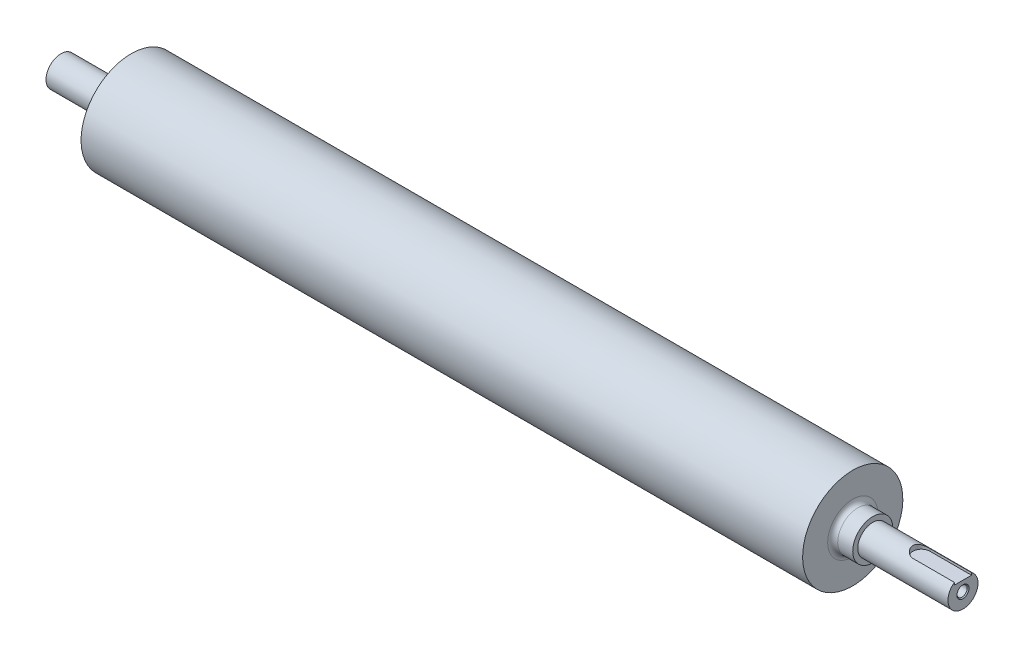
ISO-10303-21;
HEADER;
FILE_DESCRIPTION(('STEP AP214'),'2;1');
FILE_NAME('part.step','',(''),(''),'','','');
FILE_SCHEMA(('AUTOMOTIVE_DESIGN { 1 0 10303 214 1 1 1 1 }'));
ENDSEC;
DATA;
#1=APPLICATION_CONTEXT('core data for automotive mechanical design processes');
#2=APPLICATION_PROTOCOL_DEFINITION('international standard','automotive_design',2000,#1);
#3=PRODUCT_CONTEXT('',#1,'mechanical');
#4=PRODUCT('Part','Part','',(#3));
#5=PRODUCT_RELATED_PRODUCT_CATEGORY('part','',(#4));
#6=PRODUCT_DEFINITION_FORMATION('','',#4);
#7=PRODUCT_DEFINITION_CONTEXT('part definition',#1,'design');
#8=PRODUCT_DEFINITION('design','',#6,#7);
#9=PRODUCT_DEFINITION_SHAPE('','',#8);
#10=(LENGTH_UNIT() NAMED_UNIT(*) SI_UNIT(.MILLI.,.METRE.));
#11=(NAMED_UNIT(*) PLANE_ANGLE_UNIT() SI_UNIT($,.RADIAN.));
#12=(NAMED_UNIT(*) SI_UNIT($,.STERADIAN.) SOLID_ANGLE_UNIT());
#13=UNCERTAINTY_MEASURE_WITH_UNIT(LENGTH_MEASURE(1.E-05),#10,'distance_accuracy_value','');
#14=(GEOMETRIC_REPRESENTATION_CONTEXT(3) GLOBAL_UNCERTAINTY_ASSIGNED_CONTEXT((#13)) GLOBAL_UNIT_ASSIGNED_CONTEXT((#10,
#11,#12)) REPRESENTATION_CONTEXT('',''));
#15=CARTESIAN_POINT('',(0.,0.,0.));
#16=DIRECTION('',(0.,0.,1.));
#17=DIRECTION('',(1.,0.,0.));
#18=AXIS2_PLACEMENT_3D('',#15,#16,#17);
#19=CARTESIAN_POINT('',(0.,0.,0.));
#20=DIRECTION('',(-1.,0.,0.));
#21=DIRECTION('',(0.,-1.,0.));
#22=AXIS2_PLACEMENT_3D('',#19,#20,#21);
#23=PLANE('',#22);
#24=CARTESIAN_POINT('',(0.,0.,0.));
#25=DIRECTION('',(-1.,0.,0.));
#26=DIRECTION('',(0.,0.,1.));
#27=AXIS2_PLACEMENT_3D('',#24,#25,#26);
#28=CIRCLE('',#27,6.025);
#29=CARTESIAN_POINT('',(0.,0.,6.025));
#30=VERTEX_POINT('',#29);
#31=EDGE_CURVE('E124',#30,#30,#28,.T.);
#32=ORIENTED_EDGE('',*,*,#31,.F.);
#33=EDGE_LOOP('',(#32));
#34=FACE_BOUND('',#33,.T.);
#35=CARTESIAN_POINT('',(0.,0.,0.));
#36=DIRECTION('',(1.,0.,0.));
#37=DIRECTION('',(0.,1.,0.));
#38=AXIS2_PLACEMENT_3D('',#35,#36,#37);
#39=CIRCLE('',#38,15.);
#40=CARTESIAN_POINT('',(0.,15.,0.));
#41=VERTEX_POINT('',#40);
#42=EDGE_CURVE('E154',#41,#41,#39,.T.);
#43=ORIENTED_EDGE('',*,*,#42,.F.);
#44=EDGE_LOOP('',(#43));
#45=FACE_BOUND('',#44,.T.);
#46=ADVANCED_FACE('F36',(#34,#45),#23,.T.);
#47=CARTESIAN_POINT('',(900.,0.,0.));
#48=DIRECTION('',(1.,0.,0.));
#49=DIRECTION('',(0.,1.,0.));
#50=AXIS2_PLACEMENT_3D('',#47,#48,#49);
#51=CYLINDRICAL_SURFACE('',#50,15.);
#52=ORIENTED_EDGE('',*,*,#42,.T.);
#53=EDGE_LOOP('',(#52));
#54=FACE_BOUND('',#53,.T.);
#55=CARTESIAN_POINT('',(50.,0.,0.));
#56=DIRECTION('',(1.,0.,0.));
#57=DIRECTION('',(0.,1.,0.));
#58=AXIS2_PLACEMENT_3D('',#55,#56,#57);
#59=CIRCLE('',#58,15.);
#60=CARTESIAN_POINT('',(50.,15.,0.));
#61=VERTEX_POINT('',#60);
#62=EDGE_CURVE('E151',#61,#61,#59,.T.);
#63=ORIENTED_EDGE('',*,*,#62,.F.);
#64=EDGE_LOOP('',(#63));
#65=FACE_BOUND('',#64,.T.);
#66=ADVANCED_FACE('F194',(#54,#65),#51,.T.);
#67=CARTESIAN_POINT('',(50.,15.,0.));
#68=DIRECTION('',(-1.,0.,0.));
#69=DIRECTION('',(0.,-1.,0.));
#70=AXIS2_PLACEMENT_3D('',#67,#68,#69);
#71=PLANE('',#70);
#72=ORIENTED_EDGE('',*,*,#62,.T.);
#73=EDGE_LOOP('',(#72));
#74=FACE_BOUND('',#73,.T.);
#75=CARTESIAN_POINT('',(50.,0.,0.));
#76=DIRECTION('',(1.,0.,0.));
#77=DIRECTION('',(0.,1.,0.));
#78=AXIS2_PLACEMENT_3D('',#75,#76,#77);
#79=CIRCLE('',#78,20.);
#80=CARTESIAN_POINT('',(50.,20.,0.));
#81=VERTEX_POINT('',#80);
#82=EDGE_CURVE('E148',#81,#81,#79,.T.);
#83=ORIENTED_EDGE('',*,*,#82,.F.);
#84=EDGE_LOOP('',(#83));
#85=FACE_BOUND('',#84,.T.);
#86=ADVANCED_FACE('F200',(#74,#85),#71,.T.);
#87=CARTESIAN_POINT('',(900.,0.,0.));
#88=DIRECTION('',(1.,0.,0.));
#89=DIRECTION('',(0.,1.,0.));
#90=AXIS2_PLACEMENT_3D('',#87,#88,#89);
#91=CYLINDRICAL_SURFACE('',#90,20.);
#92=CARTESIAN_POINT('',(65.0000000000001,0.,0.));
#93=DIRECTION('',(-1.,0.,0.));
#94=DIRECTION('',(0.,-1.,0.));
#95=AXIS2_PLACEMENT_3D('',#92,#93,#94);
#96=CIRCLE('',#95,20.);
#97=CARTESIAN_POINT('',(65.0000000000001,-20.,0.));
#98=VERTEX_POINT('',#97);
#99=EDGE_CURVE('E160',#98,#98,#96,.T.);
#100=ORIENTED_EDGE('',*,*,#99,.T.);
#101=EDGE_LOOP('',(#100));
#102=FACE_BOUND('',#101,.T.);
#103=ORIENTED_EDGE('',*,*,#82,.T.);
#104=EDGE_LOOP('',(#103));
#105=FACE_BOUND('',#104,.T.);
#106=ADVANCED_FACE('F224',(#102,#105),#91,.T.);
#107=CARTESIAN_POINT('',(70.,20.,0.));
#108=DIRECTION('',(-1.,0.,0.));
#109=DIRECTION('',(0.,-1.,0.));
#110=AXIS2_PLACEMENT_3D('',#107,#108,#109);
#111=PLANE('',#110);
#112=CARTESIAN_POINT('',(70.,0.,0.));
#113=DIRECTION('',(-1.,0.,0.));
#114=DIRECTION('',(0.,-1.,0.));
#115=AXIS2_PLACEMENT_3D('',#112,#113,#114);
#116=CIRCLE('',#115,25.);
#117=CARTESIAN_POINT('',(70.,-25.,0.));
#118=VERTEX_POINT('',#117);
#119=EDGE_CURVE('E157',#118,#118,#116,.F.);
#120=ORIENTED_EDGE('',*,*,#119,.T.);
#121=EDGE_LOOP('',(#120));
#122=FACE_BOUND('',#121,.T.);
#123=CARTESIAN_POINT('',(70.,0.,0.));
#124=DIRECTION('',(1.,0.,0.));
#125=DIRECTION('',(0.,1.,0.));
#126=AXIS2_PLACEMENT_3D('',#123,#124,#125);
#127=CIRCLE('',#126,49.9999999999999);
#128=CARTESIAN_POINT('',(70.,49.9999999999999,0.));
#129=VERTEX_POINT('',#128);
#130=EDGE_CURVE('E145',#129,#129,#127,.T.);
#131=ORIENTED_EDGE('',*,*,#130,.F.);
#132=EDGE_LOOP('',(#131));
#133=FACE_BOUND('',#132,.T.);
#134=ADVANCED_FACE('F220',(#122,#133),#111,.T.);
#135=CARTESIAN_POINT('',(900.,0.,0.));
#136=DIRECTION('',(1.,0.,0.));
#137=DIRECTION('',(0.,1.,0.));
#138=AXIS2_PLACEMENT_3D('',#135,#136,#137);
#139=CYLINDRICAL_SURFACE('',#138,49.9999999999999);
#140=ORIENTED_EDGE('',*,*,#130,.T.);
#141=EDGE_LOOP('',(#140));
#142=FACE_BOUND('',#141,.T.);
#143=CARTESIAN_POINT('',(790.,0.,0.));
#144=DIRECTION('',(1.,0.,0.));
#145=DIRECTION('',(0.,1.,0.));
#146=AXIS2_PLACEMENT_3D('',#143,#144,#145);
#147=CIRCLE('',#146,49.9999999999998);
#148=CARTESIAN_POINT('',(790.,49.9999999999999,0.));
#149=VERTEX_POINT('',#148);
#150=EDGE_CURVE('E142',#149,#149,#147,.T.);
#151=ORIENTED_EDGE('',*,*,#150,.F.);
#152=EDGE_LOOP('',(#151));
#153=FACE_BOUND('',#152,.T.);
#154=ADVANCED_FACE('F223',(#142,#153),#139,.T.);
#155=CARTESIAN_POINT('',(790.,49.9999999999999,0.));
#156=DIRECTION('',(1.,0.,0.));
#157=DIRECTION('',(0.,1.,0.));
#158=AXIS2_PLACEMENT_3D('',#155,#156,#157);
#159=PLANE('',#158);
#160=CARTESIAN_POINT('',(790.,0.,0.));
#161=DIRECTION('',(1.,0.,0.));
#162=DIRECTION('',(0.,1.,0.));
#163=AXIS2_PLACEMENT_3D('',#160,#161,#162);
#164=CIRCLE('',#163,24.9999999999999);
#165=CARTESIAN_POINT('',(790.,25.,0.));
#166=VERTEX_POINT('',#165);
#167=EDGE_CURVE('E166',#166,#166,#164,.F.);
#168=ORIENTED_EDGE('',*,*,#167,.T.);
#169=EDGE_LOOP('',(#168));
#170=FACE_BOUND('',#169,.T.);
#171=ORIENTED_EDGE('',*,*,#150,.T.);
#172=EDGE_LOOP('',(#171));
#173=FACE_BOUND('',#172,.T.);
#174=ADVANCED_FACE('F190',(#170,#173),#159,.T.);
#175=CARTESIAN_POINT('',(900.,0.,0.));
#176=DIRECTION('',(1.,0.,0.));
#177=DIRECTION('',(0.,1.,0.));
#178=AXIS2_PLACEMENT_3D('',#175,#176,#177);
#179=CYLINDRICAL_SURFACE('',#178,19.9999999999999);
#180=CARTESIAN_POINT('',(795.,0.,0.));
#181=DIRECTION('',(1.,0.,0.));
#182=DIRECTION('',(0.,1.,0.));
#183=AXIS2_PLACEMENT_3D('',#180,#181,#182);
#184=CIRCLE('',#183,19.9999999999999);
#185=CARTESIAN_POINT('',(795.,20.,0.));
#186=VERTEX_POINT('',#185);
#187=EDGE_CURVE('E163',#186,#186,#184,.T.);
#188=ORIENTED_EDGE('',*,*,#187,.T.);
#189=EDGE_LOOP('',(#188));
#190=FACE_BOUND('',#189,.T.);
#191=CARTESIAN_POINT('',(810.,0.,0.));
#192=DIRECTION('',(1.,0.,0.));
#193=DIRECTION('',(0.,1.,0.));
#194=AXIS2_PLACEMENT_3D('',#191,#192,#193);
#195=CIRCLE('',#194,19.9999999999999);
#196=CARTESIAN_POINT('',(810.,20.,0.));
#197=VERTEX_POINT('',#196);
#198=EDGE_CURVE('E139',#197,#197,#195,.T.);
#199=ORIENTED_EDGE('',*,*,#198,.F.);
#200=EDGE_LOOP('',(#199));
#201=FACE_BOUND('',#200,.T.);
#202=ADVANCED_FACE('F184',(#190,#201),#179,.T.);
#203=CARTESIAN_POINT('',(810.,20.,0.));
#204=DIRECTION('',(1.,0.,0.));
#205=DIRECTION('',(0.,1.,0.));
#206=AXIS2_PLACEMENT_3D('',#203,#204,#205);
#207=PLANE('',#206);
#208=ORIENTED_EDGE('',*,*,#198,.T.);
#209=EDGE_LOOP('',(#208));
#210=FACE_BOUND('',#209,.T.);
#211=CARTESIAN_POINT('',(810.,0.,0.));
#212=DIRECTION('',(1.,0.,0.));
#213=DIRECTION('',(0.,1.,0.));
#214=AXIS2_PLACEMENT_3D('',#211,#212,#213);
#215=CIRCLE('',#214,14.9999999999999);
#216=CARTESIAN_POINT('',(810.,15.,0.));
#217=VERTEX_POINT('',#216);
#218=EDGE_CURVE('E136',#217,#217,#215,.T.);
#219=ORIENTED_EDGE('',*,*,#218,.F.);
#220=EDGE_LOOP('',(#219));
#221=FACE_BOUND('',#220,.T.);
#222=ADVANCED_FACE('F180',(#210,#221),#207,.T.);
#223=CARTESIAN_POINT('',(900.,0.,0.));
#224=DIRECTION('',(1.,0.,0.));
#225=DIRECTION('',(0.,1.,0.));
#226=AXIS2_PLACEMENT_3D('',#223,#224,#225);
#227=CYLINDRICAL_SURFACE('',#226,14.9999999999999);
#228=CARTESIAN_POINT('',(858.516691337462,12.3477110697649,-8.51669133746234));
#229=CARTESIAN_POINT('',(858.407672641122,12.3477077727385,-8.51669246434841));
#230=CARTESIAN_POINT('',(858.298670242355,12.3491555146544,-8.51459757874882));
#231=CARTESIAN_POINT('',(858.080908036828,12.354919753233,-8.50623275242589));
#232=CARTESIAN_POINT('',(857.972148216093,12.3592360801008,-8.49996305881431));
#233=CARTESIAN_POINT('',(857.646762698229,12.3764258314548,-8.47493488096605));
#234=CARTESIAN_POINT('',(857.430794556455,12.3935401697776,-8.44995721966952));
#235=CARTESIAN_POINT('',(857.004068723412,12.4382172396189,-8.38405074965424));
#236=CARTESIAN_POINT('',(856.793284688622,12.4657037328173,-8.3432382711422));
#237=CARTESIAN_POINT('',(856.376730376154,12.5300855913342,-8.24623176441527));
#238=CARTESIAN_POINT('',(856.170960948569,12.5669825399537,-8.19003514771556));
#239=CARTESIAN_POINT('',(855.766332803537,12.6487664406347,-8.06314926250904));
#240=CARTESIAN_POINT('',(855.567454231068,12.6936276703905,-7.99250654235003));
#241=CARTESIAN_POINT('',(855.176912286808,12.7900062713731,-7.83735135739228));
#242=CARTESIAN_POINT('',(854.985248745618,12.8415234862011,-7.75283921847733));
#243=CARTESIAN_POINT('',(854.421531968467,13.0041043325599,-7.47919319537714));
#244=CARTESIAN_POINT('',(854.061268641586,13.1230865102507,-7.27011363066637));
#245=CARTESIAN_POINT('',(853.340401071719,13.3841300765087,-6.7786665526918));
#246=CARTESIAN_POINT('',(852.983921520788,13.5272975557339,-6.49083747834792));
#247=CARTESIAN_POINT('',(852.487029309128,13.7404696222977,-6.01909036094985));
#248=CARTESIAN_POINT('',(852.327633805543,13.8112983374042,-5.85508327425442));
#249=CARTESIAN_POINT('',(852.022085635791,13.9508915557485,-5.5142092420008));
#250=CARTESIAN_POINT('',(851.875935540303,14.0196556565599,-5.33733981206233));
#251=CARTESIAN_POINT('',(851.584735150554,14.1598094627858,-4.95431118953132));
#252=CARTESIAN_POINT('',(851.441075094938,14.2308400063278,-4.74696095414549));
#253=CARTESIAN_POINT('',(851.171968887111,14.3665382417819,-4.31890675703661));
#254=CARTESIAN_POINT('',(851.046514631114,14.4312087605183,-4.09820879902976));
#255=CARTESIAN_POINT('',(850.815092010783,14.5523497288875,-3.6447452485219));
#256=CARTESIAN_POINT('',(850.709117266663,14.6088228619879,-3.41198363915));
#257=CARTESIAN_POINT('',(850.51794991014,14.7118777482923,-2.93597002576764));
#258=CARTESIAN_POINT('',(850.43275431056,14.758460923136,-2.69271953554569));
#259=CARTESIAN_POINT('',(850.290884900109,14.836666647783,-2.21939845462044));
#260=CARTESIAN_POINT('',(850.232367614676,14.8692416482904,-1.99003721841042));
#261=CARTESIAN_POINT('',(850.134481358335,14.9239995363668,-1.52603725678184));
#262=CARTESIAN_POINT('',(850.095111366646,14.9461829779281,-1.29139881339957));
#263=CARTESIAN_POINT('',(850.036135010981,14.9794930563298,-0.819030995849451));
#264=CARTESIAN_POINT('',(850.016515310743,14.9906271540986,-0.581303817344407));
#265=CARTESIAN_POINT('',(849.997307978112,15.0015264255663,-0.104789220751186));
#266=CARTESIAN_POINT('',(849.997718610467,15.0012925840829,0.133998103703245));
#267=CARTESIAN_POINT('',(850.017391605336,14.990130664963,0.583797621612019));
#268=CARTESIAN_POINT('',(850.034545250286,14.9803988347825,0.794935865094473));
#269=CARTESIAN_POINT('',(850.084429952782,14.9522097179933,1.21477685728113));
#270=CARTESIAN_POINT('',(850.117161036398,14.933752416781,1.42347960190849));
#271=CARTESIAN_POINT('',(850.197806795425,14.8885424231476,1.83700049918682));
#272=CARTESIAN_POINT('',(850.245721103872,14.8617899312133,2.04181874559542));
#273=CARTESIAN_POINT('',(850.35619628419,14.8005924094421,2.44628484920703));
#274=CARTESIAN_POINT('',(850.418757738316,14.7661470738011,2.64593250051767));
#275=CARTESIAN_POINT('',(850.558519344444,14.6899626675194,3.04068353609363));
#276=CARTESIAN_POINT('',(850.635845800832,14.6481609292471,3.2357300770082));
#277=CARTESIAN_POINT('',(850.804058482526,14.5583527793617,3.61843340420808));
#278=CARTESIAN_POINT('',(850.89494915761,14.5103443323144,3.80608773983012));
#279=CARTESIAN_POINT('',(851.186840102848,14.3584445474195,4.35656724698288));
#280=CARTESIAN_POINT('',(851.407149168595,14.2466284336565,4.70715999384036));
#281=CARTESIAN_POINT('',(851.920883766841,13.9969532552774,5.40726861391742));
#282=CARTESIAN_POINT('',(852.219736883575,13.8575799144114,5.75225900977505));
#283=CARTESIAN_POINT('',(852.705535425212,13.6460358182685,6.23027180670539));
#284=CARTESIAN_POINT('',(852.873909279694,13.5750346047997,6.3831641473334));
#285=CARTESIAN_POINT('',(853.222615146312,13.4338295512965,6.67521465650675));
#286=CARTESIAN_POINT('',(853.402949305332,13.3636258570806,6.81437034809838));
#287=CARTESIAN_POINT('',(853.793206315429,13.2189741046894,7.0912255666873));
#288=CARTESIAN_POINT('',(854.004292910521,13.1447908710425,7.22742623816511));
#289=CARTESIAN_POINT('',(854.439002717186,13.001977000061,7.48129668047002));
#290=CARTESIAN_POINT('',(854.662620216758,12.9333438671066,7.59897480280042));
#291=CARTESIAN_POINT('',(855.120801565057,12.8042901976534,7.81446714873892));
#292=CARTESIAN_POINT('',(855.355336781302,12.7438496440936,7.91233008725204));
#293=CARTESIAN_POINT('',(855.834398275209,12.6335436829447,8.08729203042861));
#294=CARTESIAN_POINT('',(856.078920518123,12.5836740541418,8.16439932663038));
#295=CARTESIAN_POINT('',(856.503749934775,12.5095058981357,8.27740280773591));
#296=CARTESIAN_POINT('',(856.682061544289,12.4819881224689,8.31876303434263));
#297=CARTESIAN_POINT('',(857.041883783593,12.4341963813942,8.39002955529108));
#298=CARTESIAN_POINT('',(857.223393448914,12.4139202699955,8.41993924306854));
#299=CARTESIAN_POINT('',(857.589546247243,12.3811244305227,8.46809672357061));
#300=CARTESIAN_POINT('',(857.774200229899,12.3686423487691,8.48628792744693));
#301=CARTESIAN_POINT('',(858.144792457804,12.3519106241566,8.51060180200336));
#302=CARTESIAN_POINT('',(858.330731475719,12.3476664636798,8.51671643570679));
#303=CARTESIAN_POINT('',(858.516691337462,12.3477110697649,8.51669133746234));
#304=B_SPLINE_CURVE_WITH_KNOTS('',3,(#228,#229,#230,#231,#232,#233,#234,#235,#236,#237,#238,
#239,#240,#241,#242,#243,#244,#245,#246,#247,#248,#249,#250,#251,#252,#253,#254,#255,#256,#257,
#258,#259,#260,#261,#262,#263,#264,#265,#266,#267,#268,#269,#270,#271,#272,#273,#274,#275,#276,
#277,#278,#279,#280,#281,#282,#283,#284,#285,#286,#287,#288,#289,#290,#291,#292,#293,#294,#295,
#296,#297,#298,#299,#300,#301,#302,#303),.UNSPECIFIED.,.F.,.F.,(4,2,2,2,2,2,2,2,2,2,2,2,2,2,2,2,
2,2,2,2,2,2,2,2,2,2,2,2,2,2,2,2,2,2,2,2,2,4),(0.,0.326994289644681,0.653969225834754,
1.30721269973033,1.95574532731684,2.60438714202298,3.25097093069432,3.8975395290373,
5.19231699698927,6.62625025568624,7.34392533637858,8.06173940712896,8.84691424496992,
9.63173850575026,10.4163052669644,11.2007591735457,11.9165677813566,12.6323382238079,
13.3476250218746,14.0628498539273,14.6982650249473,15.3336812594531,15.9690821377592,
16.604508278859,17.2456355565734,17.886973622062,19.1688442390123,20.5943975515397,
21.3086090656761,22.0229491300651,22.8077827153306,23.5922614124504,24.3747874325763,
25.1570003809022,25.7118323707824,26.2664998053613,26.8238260522251,27.3815230757821),.UNSPECIFIED.);
#305=CARTESIAN_POINT('',(858.516691337462,12.3477110697649,-8.51669133746234));
#306=VERTEX_POINT('',#305);
#307=CARTESIAN_POINT('',(858.516691337462,12.3477110697649,8.51669133746234));
#308=VERTEX_POINT('',#307);
#309=EDGE_CURVE('E11',#306,#308,#304,.T.);
#310=ORIENTED_EDGE('',*,*,#309,.F.);
#311=DIRECTION('',(1.,0.,0.));
#312=VECTOR('',#311,1.);
#313=CARTESIAN_POINT('',(900.,12.3477110697649,-8.51669133746234));
#314=LINE('',#313,#312);
#315=CARTESIAN_POINT('',(900.,12.3477110697649,-8.51669133746234));
#316=VERTEX_POINT('',#315);
#317=EDGE_CURVE('E112',#316,#306,#314,.F.);
#318=ORIENTED_EDGE('',*,*,#317,.F.);
#319=CARTESIAN_POINT('',(900.,0.,0.));
#320=DIRECTION('',(1.,0.,0.));
#321=DIRECTION('',(0.,1.,0.));
#322=AXIS2_PLACEMENT_3D('',#319,#320,#321);
#323=CIRCLE('',#322,14.9999999999999);
#324=CARTESIAN_POINT('',(900.,12.3477110697649,8.51669133746234));
#325=VERTEX_POINT('',#324);
#326=EDGE_CURVE('E133',#325,#316,#323,.T.);
#327=ORIENTED_EDGE('',*,*,#326,.F.);
#328=DIRECTION('',(1.,0.,0.));
#329=VECTOR('',#328,1.);
#330=CARTESIAN_POINT('',(900.,12.3477110697649,8.51669133746234));
#331=LINE('',#330,#329);
#332=EDGE_CURVE('E107',#308,#325,#331,.T.);
#333=ORIENTED_EDGE('',*,*,#332,.F.);
#334=EDGE_LOOP('',(#310,#318,#327,#333));
#335=FACE_BOUND('',#334,.T.);
#336=ORIENTED_EDGE('',*,*,#218,.T.);
#337=EDGE_LOOP('',(#336));
#338=FACE_BOUND('',#337,.T.);
#339=ADVANCED_FACE('F177',(#335,#338),#227,.T.);
#340=CARTESIAN_POINT('',(900.,15.,0.));
#341=DIRECTION('',(1.,0.,0.));
#342=DIRECTION('',(0.,1.,0.));
#343=AXIS2_PLACEMENT_3D('',#340,#341,#342);
#344=PLANE('',#343);
#345=DIRECTION('',(0.,1.,0.));
#346=VECTOR('',#345,1.);
#347=CARTESIAN_POINT('',(900.,10.,-8.51669133746234));
#348=LINE('',#347,#346);
#349=CARTESIAN_POINT('',(900.,10.,-8.51669133746234));
#350=VERTEX_POINT('',#349);
#351=EDGE_CURVE('E108',#350,#316,#348,.T.);
#352=ORIENTED_EDGE('',*,*,#351,.F.);
#353=DIRECTION('',(0.,0.,1.));
#354=VECTOR('',#353,1.);
#355=CARTESIAN_POINT('',(900.,10.,0.));
#356=LINE('',#355,#354);
#357=CARTESIAN_POINT('',(900.,10.,8.51669133746234));
#358=VERTEX_POINT('',#357);
#359=EDGE_CURVE('E50',#350,#358,#356,.T.);
#360=ORIENTED_EDGE('',*,*,#359,.T.);
#361=DIRECTION('',(0.,1.,0.));
#362=VECTOR('',#361,1.);
#363=CARTESIAN_POINT('',(900.,10.,8.51669133746234));
#364=LINE('',#363,#362);
#365=EDGE_CURVE('E93',#358,#325,#364,.T.);
#366=ORIENTED_EDGE('',*,*,#365,.T.);
#367=ORIENTED_EDGE('',*,*,#326,.T.);
#368=EDGE_LOOP('',(#352,#360,#366,#367));
#369=FACE_BOUND('',#368,.T.);
#370=CARTESIAN_POINT('',(900.,0.,0.));
#371=DIRECTION('',(1.,0.,0.));
#372=DIRECTION('',(0.,0.,-1.));
#373=AXIS2_PLACEMENT_3D('',#370,#371,#372);
#374=CIRCLE('',#373,6.025);
#375=CARTESIAN_POINT('',(900.,0.,-6.025));
#376=VERTEX_POINT('',#375);
#377=EDGE_CURVE('E115',#376,#376,#374,.T.);
#378=ORIENTED_EDGE('',*,*,#377,.F.);
#379=EDGE_LOOP('',(#378));
#380=FACE_BOUND('',#379,.T.);
#381=ADVANCED_FACE('F170',(#369,#380),#344,.T.);
#382=CARTESIAN_POINT('',(65.0000000000001,0.,0.));
#383=DIRECTION('',(-1.,0.,0.));
#384=DIRECTION('',(0.,-1.,0.));
#385=AXIS2_PLACEMENT_3D('',#382,#383,#384);
#386=TOROIDAL_SURFACE('',#385,25.,5.);
#387=ORIENTED_EDGE('',*,*,#99,.F.);
#388=EDGE_LOOP('',(#387));
#389=FACE_BOUND('',#388,.T.);
#390=ORIENTED_EDGE('',*,*,#119,.F.);
#391=EDGE_LOOP('',(#390));
#392=FACE_BOUND('',#391,.T.);
#393=ADVANCED_FACE('F206',(#389,#392),#386,.F.);
#394=CARTESIAN_POINT('',(795.,0.,0.));
#395=DIRECTION('',(1.,0.,0.));
#396=DIRECTION('',(0.,1.,0.));
#397=AXIS2_PLACEMENT_3D('',#394,#395,#396);
#398=TOROIDAL_SURFACE('',#397,24.9999999999999,5.);
#399=ORIENTED_EDGE('',*,*,#167,.F.);
#400=EDGE_LOOP('',(#399));
#401=FACE_BOUND('',#400,.T.);
#402=ORIENTED_EDGE('',*,*,#187,.F.);
#403=EDGE_LOOP('',(#402));
#404=FACE_BOUND('',#403,.T.);
#405=ADVANCED_FACE('F38',(#401,#404),#398,.F.);
#406=CARTESIAN_POINT('',(29.25,0.,0.));
#407=DIRECTION('',(-1.,0.,0.));
#408=DIRECTION('',(0.,0.,1.));
#409=AXIS2_PLACEMENT_3D('',#406,#407,#408);
#410=CONICAL_SURFACE('',#409,5.09999999999998,1.02974425867665);
#411=CARTESIAN_POINT('',(32.3143891570406,0.,0.));
#412=VERTEX_POINT('',#411);
#413=VERTEX_LOOP('',#412);
#414=FACE_BOUND('',#413,.T.);
#415=CARTESIAN_POINT('',(29.25,0.,0.));
#416=DIRECTION('',(-1.,0.,0.));
#417=DIRECTION('',(0.,0.,1.));
#418=AXIS2_PLACEMENT_3D('',#415,#416,#417);
#419=CIRCLE('',#418,5.09999999999998);
#420=CARTESIAN_POINT('',(29.25,0.,5.09999999999998));
#421=VERTEX_POINT('',#420);
#422=EDGE_CURVE('E130',#421,#421,#419,.T.);
#423=ORIENTED_EDGE('',*,*,#422,.T.);
#424=EDGE_LOOP('',(#423));
#425=FACE_BOUND('',#424,.T.);
#426=ADVANCED_FACE('F213',(#414,#425),#410,.F.);
#427=CARTESIAN_POINT('',(0.,0.,0.));
#428=DIRECTION('',(-1.,0.,0.));
#429=DIRECTION('',(0.,0.,1.));
#430=AXIS2_PLACEMENT_3D('',#427,#428,#429);
#431=CYLINDRICAL_SURFACE('',#430,5.09999999999999);
#432=ORIENTED_EDGE('',*,*,#422,.F.);
#433=EDGE_LOOP('',(#432));
#434=FACE_BOUND('',#433,.T.);
#435=CARTESIAN_POINT('',(0.925000000000023,0.,0.));
#436=DIRECTION('',(-1.,0.,0.));
#437=DIRECTION('',(0.,0.,1.));
#438=AXIS2_PLACEMENT_3D('',#435,#436,#437);
#439=CIRCLE('',#438,5.09999999999999);
#440=CARTESIAN_POINT('',(0.925000000000023,0.,5.09999999999999));
#441=VERTEX_POINT('',#440);
#442=EDGE_CURVE('E127',#441,#441,#439,.T.);
#443=ORIENTED_EDGE('',*,*,#442,.T.);
#444=EDGE_LOOP('',(#443));
#445=FACE_BOUND('',#444,.T.);
#446=ADVANCED_FACE('F317',(#434,#445),#431,.F.);
#447=CARTESIAN_POINT('',(0.,0.,0.));
#448=DIRECTION('',(-1.,0.,0.));
#449=DIRECTION('',(0.,0.,1.));
#450=AXIS2_PLACEMENT_3D('',#447,#448,#449);
#451=CONICAL_SURFACE('',#450,6.025,0.785398163397443);
#452=ORIENTED_EDGE('',*,*,#442,.F.);
#453=EDGE_LOOP('',(#452));
#454=FACE_BOUND('',#453,.T.);
#455=ORIENTED_EDGE('',*,*,#31,.T.);
#456=EDGE_LOOP('',(#455));
#457=FACE_BOUND('',#456,.T.);
#458=ADVANCED_FACE('F327',(#454,#457),#451,.F.);
#459=CARTESIAN_POINT('',(870.75,0.,0.));
#460=DIRECTION('',(1.,0.,0.));
#461=DIRECTION('',(0.,0.,-1.));
#462=AXIS2_PLACEMENT_3D('',#459,#460,#461);
#463=CONICAL_SURFACE('',#462,5.09999999999998,1.02974425867665);
#464=CARTESIAN_POINT('',(867.685610842959,0.,0.));
#465=VERTEX_POINT('',#464);
#466=VERTEX_LOOP('',#465);
#467=FACE_BOUND('',#466,.T.);
#468=CARTESIAN_POINT('',(870.75,0.,0.));
#469=DIRECTION('',(1.,0.,0.));
#470=DIRECTION('',(0.,0.,-1.));
#471=AXIS2_PLACEMENT_3D('',#468,#469,#470);
#472=CIRCLE('',#471,5.09999999999998);
#473=CARTESIAN_POINT('',(870.75,0.,-5.09999999999998));
#474=VERTEX_POINT('',#473);
#475=EDGE_CURVE('E121',#474,#474,#472,.T.);
#476=ORIENTED_EDGE('',*,*,#475,.T.);
#477=EDGE_LOOP('',(#476));
#478=FACE_BOUND('',#477,.T.);
#479=ADVANCED_FACE('F338',(#467,#478),#463,.F.);
#480=CARTESIAN_POINT('',(900.,0.,0.));
#481=DIRECTION('',(1.,0.,0.));
#482=DIRECTION('',(0.,0.,-1.));
#483=AXIS2_PLACEMENT_3D('',#480,#481,#482);
#484=CYLINDRICAL_SURFACE('',#483,5.09999999999999);
#485=ORIENTED_EDGE('',*,*,#475,.F.);
#486=EDGE_LOOP('',(#485));
#487=FACE_BOUND('',#486,.T.);
#488=CARTESIAN_POINT('',(899.075,0.,0.));
#489=DIRECTION('',(1.,0.,0.));
#490=DIRECTION('',(0.,0.,-1.));
#491=AXIS2_PLACEMENT_3D('',#488,#489,#490);
#492=CIRCLE('',#491,5.09999999999999);
#493=CARTESIAN_POINT('',(899.075,0.,-5.09999999999999));
#494=VERTEX_POINT('',#493);
#495=EDGE_CURVE('E118',#494,#494,#492,.T.);
#496=ORIENTED_EDGE('',*,*,#495,.T.);
#497=EDGE_LOOP('',(#496));
#498=FACE_BOUND('',#497,.T.);
#499=ADVANCED_FACE('F349',(#487,#498),#484,.F.);
#500=CARTESIAN_POINT('',(900.,0.,0.));
#501=DIRECTION('',(1.,0.,0.));
#502=DIRECTION('',(0.,0.,-1.));
#503=AXIS2_PLACEMENT_3D('',#500,#501,#502);
#504=CONICAL_SURFACE('',#503,6.025,0.785398163397421);
#505=ORIENTED_EDGE('',*,*,#495,.F.);
#506=EDGE_LOOP('',(#505));
#507=FACE_BOUND('',#506,.T.);
#508=ORIENTED_EDGE('',*,*,#377,.T.);
#509=EDGE_LOOP('',(#508));
#510=FACE_BOUND('',#509,.T.);
#511=ADVANCED_FACE('F360',(#507,#510),#504,.F.);
#512=CARTESIAN_POINT('',(858.516691337462,10.,0.));
#513=DIRECTION('',(0.,1.,0.));
#514=DIRECTION('',(0.,0.,1.));
#515=AXIS2_PLACEMENT_3D('',#512,#513,#514);
#516=CYLINDRICAL_SURFACE('',#515,8.51669133746234);
#517=DIRECTION('',(0.,1.,0.));
#518=VECTOR('',#517,1.);
#519=CARTESIAN_POINT('',(858.516691337462,10.,-8.51669133746234));
#520=LINE('',#519,#518);
#521=CARTESIAN_POINT('',(858.516691337462,10.,-8.51669133746234));
#522=VERTEX_POINT('',#521);
#523=EDGE_CURVE('E105',#522,#306,#520,.T.);
#524=ORIENTED_EDGE('',*,*,#523,.T.);
#525=ORIENTED_EDGE('',*,*,#309,.T.);
#526=DIRECTION('',(0.,1.,0.));
#527=VECTOR('',#526,1.);
#528=CARTESIAN_POINT('',(858.516691337462,10.,8.51669133746234));
#529=LINE('',#528,#527);
#530=CARTESIAN_POINT('',(858.516691337462,10.,8.51669133746234));
#531=VERTEX_POINT('',#530);
#532=EDGE_CURVE('E86',#531,#308,#529,.T.);
#533=ORIENTED_EDGE('',*,*,#532,.F.);
#534=CARTESIAN_POINT('',(858.516691337462,10.,0.));
#535=DIRECTION('',(0.,1.,0.));
#536=DIRECTION('',(0.,0.,1.));
#537=AXIS2_PLACEMENT_3D('',#534,#535,#536);
#538=CIRCLE('',#537,8.51669133746234);
#539=EDGE_CURVE('E89',#522,#531,#538,.T.);
#540=ORIENTED_EDGE('',*,*,#539,.F.);
#541=EDGE_LOOP('',(#524,#525,#533,#540));
#542=FACE_BOUND('',#541,.T.);
#543=ADVANCED_FACE('F88',(#542),#516,.F.);
#544=CARTESIAN_POINT('',(858.516691337462,10.,-8.51669133746234));
#545=DIRECTION('',(0.,0.,-1.));
#546=DIRECTION('',(-1.,0.,0.));
#547=AXIS2_PLACEMENT_3D('',#544,#545,#546);
#548=PLANE('',#547);
#549=ORIENTED_EDGE('',*,*,#317,.T.);
#550=ORIENTED_EDGE('',*,*,#523,.F.);
#551=DIRECTION('',(-1.,0.,0.));
#552=VECTOR('',#551,1.);
#553=CARTESIAN_POINT('',(858.516691337462,10.,-8.51669133746234));
#554=LINE('',#553,#552);
#555=EDGE_CURVE('E94',#350,#522,#554,.T.);
#556=ORIENTED_EDGE('',*,*,#555,.F.);
#557=ORIENTED_EDGE('',*,*,#351,.T.);
#558=EDGE_LOOP('',(#549,#550,#556,#557));
#559=FACE_BOUND('',#558,.T.);
#560=ADVANCED_FACE('F174',(#559),#548,.F.);
#561=CARTESIAN_POINT('',(858.516691337462,10.,8.51669133746234));
#562=DIRECTION('',(0.,0.,1.));
#563=DIRECTION('',(1.,0.,0.));
#564=AXIS2_PLACEMENT_3D('',#561,#562,#563);
#565=PLANE('',#564);
#566=ORIENTED_EDGE('',*,*,#332,.T.);
#567=ORIENTED_EDGE('',*,*,#365,.F.);
#568=DIRECTION('',(1.,0.,0.));
#569=VECTOR('',#568,1.);
#570=CARTESIAN_POINT('',(858.516691337462,10.,8.51669133746234));
#571=LINE('',#570,#569);
#572=EDGE_CURVE('E57',#531,#358,#571,.T.);
#573=ORIENTED_EDGE('',*,*,#572,.F.);
#574=ORIENTED_EDGE('',*,*,#532,.T.);
#575=EDGE_LOOP('',(#566,#567,#573,#574));
#576=FACE_BOUND('',#575,.T.);
#577=ADVANCED_FACE('F96',(#576),#565,.F.);
#578=CARTESIAN_POINT('',(858.516691337462,10.,0.));
#579=DIRECTION('',(0.,1.,0.));
#580=DIRECTION('',(0.,0.,1.));
#581=AXIS2_PLACEMENT_3D('',#578,#579,#580);
#582=PLANE('',#581);
#583=ORIENTED_EDGE('',*,*,#555,.T.);
#584=ORIENTED_EDGE('',*,*,#539,.T.);
#585=ORIENTED_EDGE('',*,*,#572,.T.);
#586=ORIENTED_EDGE('',*,*,#359,.F.);
#587=EDGE_LOOP('',(#583,#584,#585,#586));
#588=FACE_BOUND('',#587,.T.);
#589=ADVANCED_FACE('F100',(#588),#582,.T.);
#590=CLOSED_SHELL('',(#46,#66,#86,#106,#134,#154,#174,#202,#222,#339,#381,#393,#405,#426,#446,
#458,#479,#499,#511,#543,#560,#577,#589));
#591=MANIFOLD_SOLID_BREP('B2',#590);
#592=ADVANCED_BREP_SHAPE_REPRESENTATION('',(#18,#591),#14);
#593=SHAPE_DEFINITION_REPRESENTATION(#9,#592);
ENDSEC;
END-ISO-10303-21;
